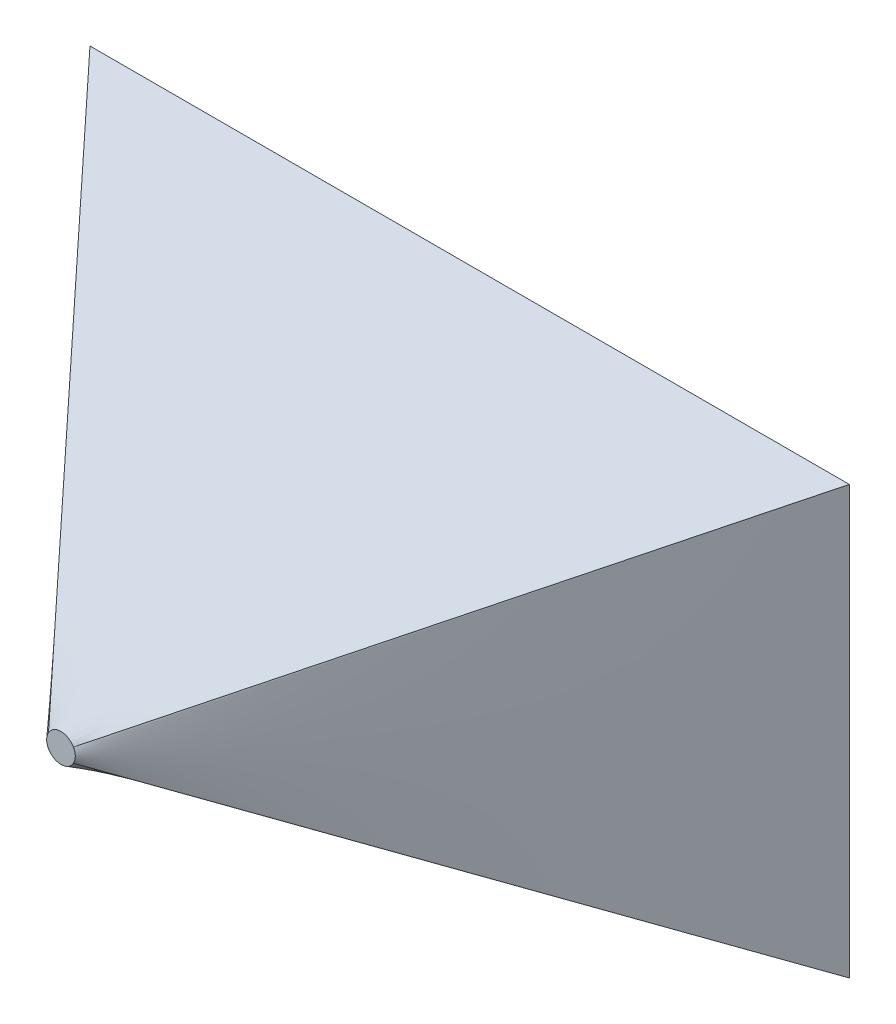
ISO-10303-21;
HEADER;
FILE_DESCRIPTION(('STEP AP214'),'2;1');
FILE_NAME('part.step','',(''),(''),'','','');
FILE_SCHEMA(('AUTOMOTIVE_DESIGN { 1 0 10303 214 1 1 1 1 }'));
ENDSEC;
DATA;
#1=APPLICATION_CONTEXT('core data for automotive mechanical design processes');
#2=APPLICATION_PROTOCOL_DEFINITION('international standard','automotive_design',2000,#1);
#3=PRODUCT_CONTEXT('',#1,'mechanical');
#4=PRODUCT('Part','Part','',(#3));
#5=PRODUCT_RELATED_PRODUCT_CATEGORY('part','',(#4));
#6=PRODUCT_DEFINITION_FORMATION('','',#4);
#7=PRODUCT_DEFINITION_CONTEXT('part definition',#1,'design');
#8=PRODUCT_DEFINITION('design','',#6,#7);
#9=PRODUCT_DEFINITION_SHAPE('','',#8);
#10=(LENGTH_UNIT() NAMED_UNIT(*) SI_UNIT(.MILLI.,.METRE.));
#11=(NAMED_UNIT(*) PLANE_ANGLE_UNIT() SI_UNIT($,.RADIAN.));
#12=(NAMED_UNIT(*) SI_UNIT($,.STERADIAN.) SOLID_ANGLE_UNIT());
#13=UNCERTAINTY_MEASURE_WITH_UNIT(LENGTH_MEASURE(1.E-05),#10,'distance_accuracy_value','');
#14=(GEOMETRIC_REPRESENTATION_CONTEXT(3) GLOBAL_UNCERTAINTY_ASSIGNED_CONTEXT((#13)) GLOBAL_UNIT_ASSIGNED_CONTEXT((#10,
#11,#12)) REPRESENTATION_CONTEXT('',''));
#15=CARTESIAN_POINT('',(0.,0.,0.));
#16=DIRECTION('',(0.,0.,1.));
#17=DIRECTION('',(1.,0.,0.));
#18=AXIS2_PLACEMENT_3D('',#15,#16,#17);
#19=CARTESIAN_POINT('',(0.,0.,0.));
#20=DIRECTION('',(0.,0.,1.));
#21=DIRECTION('',(1.,0.,0.));
#22=AXIS2_PLACEMENT_3D('',#19,#20,#21);
#23=PLANE('',#22);
#24=DIRECTION('',(0.,1.,0.));
#25=VECTOR('',#24,1.);
#26=CARTESIAN_POINT('',(185.8,104.6,0.));
#27=LINE('',#26,#25);
#28=CARTESIAN_POINT('',(185.8,-104.6,0.));
#29=VERTEX_POINT('',#28);
#30=CARTESIAN_POINT('',(185.8,104.6,0.));
#31=VERTEX_POINT('',#30);
#32=EDGE_CURVE('E118',#29,#31,#27,.T.);
#33=ORIENTED_EDGE('',*,*,#32,.F.);
#34=DIRECTION('',(1.,0.,0.));
#35=VECTOR('',#34,1.);
#36=CARTESIAN_POINT('',(-185.8,-104.6,0.));
#37=LINE('',#36,#35);
#38=CARTESIAN_POINT('',(-185.8,-104.6,0.));
#39=VERTEX_POINT('',#38);
#40=EDGE_CURVE('E267',#39,#29,#37,.T.);
#41=ORIENTED_EDGE('',*,*,#40,.F.);
#42=DIRECTION('',(0.,-1.,0.));
#43=VECTOR('',#42,1.);
#44=CARTESIAN_POINT('',(-185.8,104.6,0.));
#45=LINE('',#44,#43);
#46=CARTESIAN_POINT('',(-185.8,104.6,0.));
#47=VERTEX_POINT('',#46);
#48=EDGE_CURVE('E75',#47,#39,#45,.T.);
#49=ORIENTED_EDGE('',*,*,#48,.F.);
#50=DIRECTION('',(-1.,0.,0.));
#51=VECTOR('',#50,1.);
#52=CARTESIAN_POINT('',(-185.8,104.6,0.));
#53=LINE('',#52,#51);
#54=EDGE_CURVE('E12',#31,#47,#53,.T.);
#55=ORIENTED_EDGE('',*,*,#54,.F.);
#56=EDGE_LOOP('',(#33,#41,#49,#55));
#57=FACE_BOUND('',#56,.T.);
#58=ADVANCED_FACE('F65',(#57),#23,.F.);
#59=CARTESIAN_POINT('',(0.,0.,200.));
#60=DIRECTION('',(0.,0.,1.));
#61=DIRECTION('',(1.,0.,0.));
#62=AXIS2_PLACEMENT_3D('',#59,#60,#61);
#63=PLANE('',#62);
#64=CARTESIAN_POINT('',(0.,0.,200.));
#65=DIRECTION('',(0.,0.,1.));
#66=DIRECTION('',(1.,0.,0.));
#67=AXIS2_PLACEMENT_3D('',#64,#65,#66);
#68=CIRCLE('',#67,7.);
#69=CARTESIAN_POINT('',(6.09980090044764,3.43401062533274,200.));
#70=VERTEX_POINT('',#69);
#71=CARTESIAN_POINT('',(-6.09980090044764,3.43401062533274,200.));
#72=VERTEX_POINT('',#71);
#73=EDGE_CURVE('E123',#70,#72,#68,.T.);
#74=ORIENTED_EDGE('',*,*,#73,.T.);
#75=CARTESIAN_POINT('',(-6.09980090044764,-3.43401062533274,200.));
#76=VERTEX_POINT('',#75);
#77=EDGE_CURVE('E129',#72,#76,#68,.T.);
#78=ORIENTED_EDGE('',*,*,#77,.T.);
#79=CARTESIAN_POINT('',(6.09980090044764,-3.43401062533274,200.));
#80=VERTEX_POINT('',#79);
#81=EDGE_CURVE('E136',#76,#80,#68,.T.);
#82=ORIENTED_EDGE('',*,*,#81,.T.);
#83=EDGE_CURVE('E115',#80,#70,#68,.T.);
#84=ORIENTED_EDGE('',*,*,#83,.T.);
#85=EDGE_LOOP('',(#74,#78,#82,#84));
#86=FACE_BOUND('',#85,.T.);
#87=ADVANCED_FACE('F134',(#86),#63,.T.);
#88=CARTESIAN_POINT('',(-6.09980090044764,-3.43401062533274,200.));
#89=CARTESIAN_POINT('',(-185.8,-104.6,0.));
#90=CARTESIAN_POINT('',(-6.38057301889759,-2.93527774189104,200.));
#91=CARTESIAN_POINT('',(-185.8,-87.1666666666667,0.));
#92=CARTESIAN_POINT('',(-6.60857455061495,-2.38502526260603,200.));
#93=CARTESIAN_POINT('',(-185.8,-69.7333333333333,0.));
#94=CARTESIAN_POINT('',(-6.91852006001882,-1.22298130542607,200.));
#95=CARTESIAN_POINT('',(-185.8,-34.8666666666667,0.));
#96=CARTESIAN_POINT('',(-7.,-0.611665132928542,200.));
#97=CARTESIAN_POINT('',(-185.8,-17.4333333333334,0.));
#98=CARTESIAN_POINT('',(-7.,0.61166513292854,200.));
#99=CARTESIAN_POINT('',(-185.8,17.4333333333333,0.));
#100=CARTESIAN_POINT('',(-6.91852006001882,1.22298130542607,200.));
#101=CARTESIAN_POINT('',(-185.8,34.8666666666666,0.));
#102=CARTESIAN_POINT('',(-6.60857455061494,2.38502526260603,200.));
#103=CARTESIAN_POINT('',(-185.8,69.7333333333333,0.));
#104=CARTESIAN_POINT('',(-6.3805730188976,2.93527774189104,200.));
#105=CARTESIAN_POINT('',(-185.8,87.1666666666667,0.));
#106=CARTESIAN_POINT('',(-6.09980090044764,3.43401062533274,200.));
#107=CARTESIAN_POINT('',(-185.8,104.6,0.));
#108=B_SPLINE_SURFACE_WITH_KNOTS('',3,1,((#88,#89),(#90,#91),(#92,#93),(#94,#95),(#96,#97),(#98,
#99),(#100,#101),(#102,#103),(#104,#105),(#106,#107)),.UNSPECIFIED.,.F.,.F.,.F.,(4,2,2,2,4),(2,
2),(0.,0.25,0.5,0.75,1.),(0.,1.),.UNSPECIFIED.);
#109=DIRECTION('',(-0.625534502135445,0.352157744474529,-0.696197895461322));
#110=VECTOR('',#109,1.);
#111=CARTESIAN_POINT('',(-95.9499004502238,54.0170053126664,100.));
#112=LINE('',#111,#110);
#113=EDGE_CURVE('E90',#72,#47,#112,.T.);
#114=DIRECTION('',(0.625534502135444,0.352157744474529,0.696197895461322));
#115=VECTOR('',#114,1.);
#116=CARTESIAN_POINT('',(-95.9499004502238,-54.0170053126664,100.));
#117=LINE('',#116,#115);
#118=EDGE_CURVE('E128',#39,#76,#117,.T.);
#119=ORIENTED_EDGE('',*,*,#77,.F.);
#120=ORIENTED_EDGE('',*,*,#113,.T.);
#121=ORIENTED_EDGE('',*,*,#48,.T.);
#122=ORIENTED_EDGE('',*,*,#118,.T.);
#123=EDGE_LOOP('',(#119,#120,#121,#122));
#124=FACE_BOUND('',#123,.T.);
#125=ADVANCED_FACE('F157',(#124),#108,.T.);
#126=CARTESIAN_POINT('',(-6.09980090044764,3.43401062533274,200.));
#127=CARTESIAN_POINT('',(-185.8,104.6,0.));
#128=CARTESIAN_POINT('',(-5.85043445872679,3.87695789944109,200.));
#129=CARTESIAN_POINT('',(-170.316666666667,104.6,0.));
#130=CARTESIAN_POINT('',(-5.53617608365941,4.3218068074305,200.));
#131=CARTESIAN_POINT('',(-154.833333333334,104.6,0.));
#132=CARTESIAN_POINT('',(-4.76101508924641,5.16333177609217,200.));
#133=CARTESIAN_POINT('',(-123.866666666667,104.6,0.));
#134=CARTESIAN_POINT('',(-4.2995588373065,5.55955243128625,200.));
#135=CARTESIAN_POINT('',(-108.383333333334,104.6,0.));
#136=CARTESIAN_POINT('',(-3.24069567843075,6.23640288559691,200.));
#137=CARTESIAN_POINT('',(-77.4166666666671,104.6,0.));
#138=CARTESIAN_POINT('',(-2.6431810455875,6.51609711024539,200.));
#139=CARTESIAN_POINT('',(-61.9333333333338,104.6,0.));
#140=CARTESIAN_POINT('',(-1.36348755019768,6.89832075873233,200.));
#141=CARTESIAN_POINT('',(-30.9666666666672,104.6,0.));
#142=CARTESIAN_POINT('',(-0.682042087112466,7.,200.));
#143=CARTESIAN_POINT('',(-15.4833333333339,104.6,0.));
#144=CARTESIAN_POINT('',(0.682042087112464,7.,200.));
#145=CARTESIAN_POINT('',(15.4833333333328,104.6,0.));
#146=CARTESIAN_POINT('',(1.36348755019768,6.89832075873233,200.));
#147=CARTESIAN_POINT('',(30.9666666666662,104.6,0.));
#148=CARTESIAN_POINT('',(2.6431810455875,6.51609711024539,200.));
#149=CARTESIAN_POINT('',(61.9333333333328,104.6,0.));
#150=CARTESIAN_POINT('',(3.24069567843074,6.23640288559691,200.));
#151=CARTESIAN_POINT('',(77.4166666666662,104.6,0.));
#152=CARTESIAN_POINT('',(4.29955883730649,5.55955243128625,200.));
#153=CARTESIAN_POINT('',(108.383333333333,104.6,0.));
#154=CARTESIAN_POINT('',(4.76101508924641,5.16333177609216,200.));
#155=CARTESIAN_POINT('',(123.866666666666,104.6,0.));
#156=CARTESIAN_POINT('',(5.53617608365941,4.3218068074305,200.));
#157=CARTESIAN_POINT('',(154.833333333333,104.6,0.));
#158=CARTESIAN_POINT('',(5.85043445872679,3.87695789944109,200.));
#159=CARTESIAN_POINT('',(170.316666666667,104.6,0.));
#160=CARTESIAN_POINT('',(6.09980090044764,3.43401062533274,200.));
#161=CARTESIAN_POINT('',(185.8,104.6,0.));
#162=B_SPLINE_SURFACE_WITH_KNOTS('',3,1,((#126,#127),(#128,#129),(#130,#131),(#132,#133),(#134,
#135),(#136,#137),(#138,#139),(#140,#141),(#142,#143),(#144,#145),(#146,#147),(#148,#149),(#150,
#151),(#152,#153),(#154,#155),(#156,#157),(#158,#159),(#160,#161)),.UNSPECIFIED.,.F.,.F.,.F.,(4,
2,2,2,2,2,2,2,4),(2,2),(0.,0.125,0.25,0.375,0.5,0.625,0.75,0.875,1.),(0.,1.),.UNSPECIFIED.);
#163=DIRECTION('',(0.625534502135445,0.352157744474529,-0.696197895461322));
#164=VECTOR('',#163,1.);
#165=CARTESIAN_POINT('',(95.9499004502239,54.0170053126664,100.));
#166=LINE('',#165,#164);
#167=EDGE_CURVE('E110',#70,#31,#166,.T.);
#168=ORIENTED_EDGE('',*,*,#73,.F.);
#169=ORIENTED_EDGE('',*,*,#167,.T.);
#170=ORIENTED_EDGE('',*,*,#54,.T.);
#171=ORIENTED_EDGE('',*,*,#113,.F.);
#172=EDGE_LOOP('',(#168,#169,#170,#171));
#173=FACE_BOUND('',#172,.T.);
#174=ADVANCED_FACE('F125',(#173),#162,.T.);
#175=CARTESIAN_POINT('',(6.09980090044764,-3.43401062533274,200.));
#176=CARTESIAN_POINT('',(185.8,-104.6,0.));
#177=CARTESIAN_POINT('',(5.85043445872679,-3.8769578994411,200.));
#178=CARTESIAN_POINT('',(170.316666666667,-104.6,0.));
#179=CARTESIAN_POINT('',(5.53617608365941,-4.3218068074305,200.));
#180=CARTESIAN_POINT('',(154.833333333333,-104.6,0.));
#181=CARTESIAN_POINT('',(4.76101508924641,-5.16333177609217,200.));
#182=CARTESIAN_POINT('',(123.866666666667,-104.6,0.));
#183=CARTESIAN_POINT('',(4.29955883730649,-5.55955243128625,200.));
#184=CARTESIAN_POINT('',(108.383333333333,-104.6,0.));
#185=CARTESIAN_POINT('',(3.24069567843074,-6.23640288559691,200.));
#186=CARTESIAN_POINT('',(77.4166666666668,-104.6,0.));
#187=CARTESIAN_POINT('',(2.6431810455875,-6.5160971102454,200.));
#188=CARTESIAN_POINT('',(61.9333333333335,-104.6,0.));
#189=CARTESIAN_POINT('',(1.36348755019768,-6.89832075873233,200.));
#190=CARTESIAN_POINT('',(30.9666666666668,-104.6,0.));
#191=CARTESIAN_POINT('',(0.682042087112465,-7.,200.));
#192=CARTESIAN_POINT('',(15.4833333333335,-104.6,0.));
#193=CARTESIAN_POINT('',(-0.682042087112466,-7.,200.));
#194=CARTESIAN_POINT('',(-15.4833333333332,-104.6,0.));
#195=CARTESIAN_POINT('',(-1.36348755019768,-6.89832075873232,200.));
#196=CARTESIAN_POINT('',(-30.9666666666665,-104.6,0.));
#197=CARTESIAN_POINT('',(-2.6431810455875,-6.51609711024539,200.));
#198=CARTESIAN_POINT('',(-61.9333333333332,-104.6,0.));
#199=CARTESIAN_POINT('',(-3.24069567843074,-6.23640288559691,200.));
#200=CARTESIAN_POINT('',(-77.4166666666665,-104.6,0.));
#201=CARTESIAN_POINT('',(-4.29955883730649,-5.55955243128625,200.));
#202=CARTESIAN_POINT('',(-108.383333333333,-104.6,0.));
#203=CARTESIAN_POINT('',(-4.76101508924641,-5.16333177609216,200.));
#204=CARTESIAN_POINT('',(-123.866666666667,-104.6,0.));
#205=CARTESIAN_POINT('',(-5.53617608365941,-4.3218068074305,200.));
#206=CARTESIAN_POINT('',(-154.833333333333,-104.6,0.));
#207=CARTESIAN_POINT('',(-5.85043445872679,-3.87695789944109,200.));
#208=CARTESIAN_POINT('',(-170.316666666667,-104.6,0.));
#209=CARTESIAN_POINT('',(-6.09980090044764,-3.43401062533274,200.));
#210=CARTESIAN_POINT('',(-185.8,-104.6,0.));
#211=B_SPLINE_SURFACE_WITH_KNOTS('',3,1,((#175,#176),(#177,#178),(#179,#180),(#181,#182),(#183,
#184),(#185,#186),(#187,#188),(#189,#190),(#191,#192),(#193,#194),(#195,#196),(#197,#198),(#199,
#200),(#201,#202),(#203,#204),(#205,#206),(#207,#208),(#209,#210)),.UNSPECIFIED.,.F.,.F.,.F.,(4,
2,2,2,2,2,2,2,4),(2,2),(0.,0.125,0.25,0.375,0.5,0.625,0.75,0.875,1.),(0.,1.),.UNSPECIFIED.);
#212=DIRECTION('',(0.625534502135445,-0.352157744474529,-0.696197895461322));
#213=VECTOR('',#212,1.);
#214=CARTESIAN_POINT('',(95.9499004502239,-54.0170053126664,100.));
#215=LINE('',#214,#213);
#216=EDGE_CURVE('E121',#80,#29,#215,.T.);
#217=ORIENTED_EDGE('',*,*,#81,.F.);
#218=ORIENTED_EDGE('',*,*,#118,.F.);
#219=ORIENTED_EDGE('',*,*,#40,.T.);
#220=ORIENTED_EDGE('',*,*,#216,.F.);
#221=EDGE_LOOP('',(#217,#218,#219,#220));
#222=FACE_BOUND('',#221,.T.);
#223=ADVANCED_FACE('F191',(#222),#211,.T.);
#224=CARTESIAN_POINT('',(6.09980090044764,3.43401062533274,200.));
#225=CARTESIAN_POINT('',(185.8,104.6,0.));
#226=CARTESIAN_POINT('',(6.3805730188976,2.93527774189104,200.));
#227=CARTESIAN_POINT('',(185.8,87.1666666666667,0.));
#228=CARTESIAN_POINT('',(6.60857455061495,2.38502526260603,200.));
#229=CARTESIAN_POINT('',(185.8,69.7333333333334,0.));
#230=CARTESIAN_POINT('',(6.91852006001882,1.22298130542607,200.));
#231=CARTESIAN_POINT('',(185.8,34.8666666666668,0.));
#232=CARTESIAN_POINT('',(7.,0.611665132928541,200.));
#233=CARTESIAN_POINT('',(185.8,17.4333333333335,0.));
#234=CARTESIAN_POINT('',(7.,-0.611665132928542,200.));
#235=CARTESIAN_POINT('',(185.8,-17.4333333333332,0.));
#236=CARTESIAN_POINT('',(6.91852006001882,-1.22298130542607,200.));
#237=CARTESIAN_POINT('',(185.8,-34.8666666666665,0.));
#238=CARTESIAN_POINT('',(6.60857455061495,-2.38502526260604,200.));
#239=CARTESIAN_POINT('',(185.8,-69.7333333333332,0.));
#240=CARTESIAN_POINT('',(6.3805730188976,-2.93527774189104,200.));
#241=CARTESIAN_POINT('',(185.8,-87.1666666666666,0.));
#242=CARTESIAN_POINT('',(6.09980090044764,-3.43401062533274,200.));
#243=CARTESIAN_POINT('',(185.8,-104.6,0.));
#244=B_SPLINE_SURFACE_WITH_KNOTS('',3,1,((#224,#225),(#226,#227),(#228,#229),(#230,#231),(#232,
#233),(#234,#235),(#236,#237),(#238,#239),(#240,#241),(#242,#243)),.UNSPECIFIED.,.F.,.F.,.F.,(4,
2,2,2,4),(2,2),(0.,0.25,0.5,0.75,1.),(0.,1.),.UNSPECIFIED.);
#245=ORIENTED_EDGE('',*,*,#83,.F.);
#246=ORIENTED_EDGE('',*,*,#216,.T.);
#247=ORIENTED_EDGE('',*,*,#32,.T.);
#248=ORIENTED_EDGE('',*,*,#167,.F.);
#249=EDGE_LOOP('',(#245,#246,#247,#248));
#250=FACE_BOUND('',#249,.T.);
#251=ADVANCED_FACE('F112',(#250),#244,.T.);
#252=CLOSED_SHELL('',(#58,#87,#125,#174,#223,#251));
#253=MANIFOLD_SOLID_BREP('B2',#252);
#254=ADVANCED_BREP_SHAPE_REPRESENTATION('',(#18,#253),#14);
#255=SHAPE_DEFINITION_REPRESENTATION(#9,#254);
ENDSEC;
END-ISO-10303-21;
